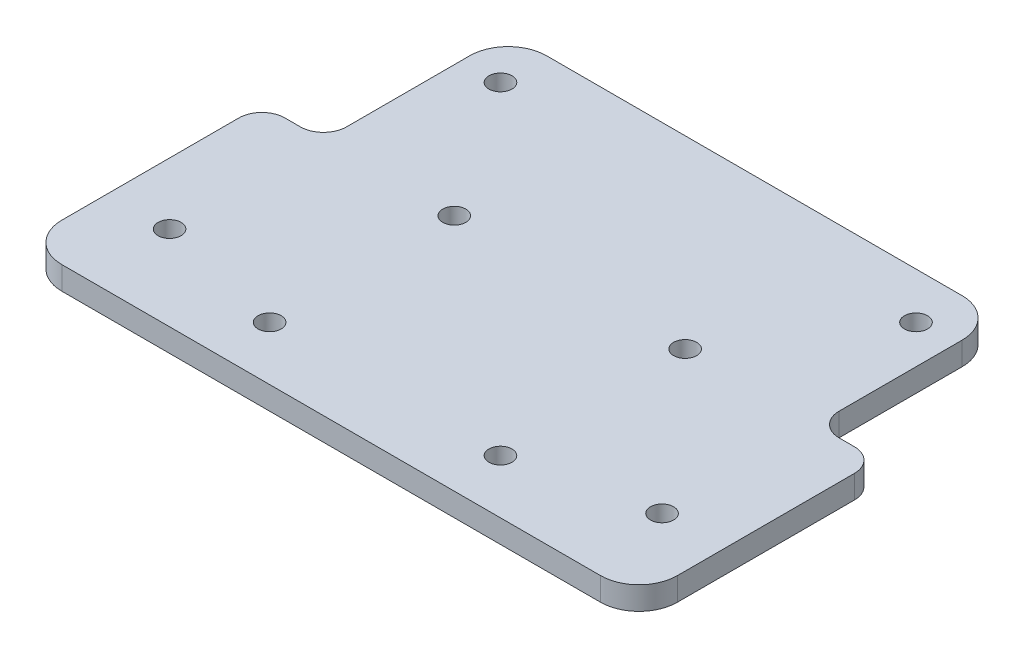
ISO-10303-21;
HEADER;
FILE_DESCRIPTION(('STEP AP214'),'2;1');
FILE_NAME('part.step','',(''),(''),'','','');
FILE_SCHEMA(('AUTOMOTIVE_DESIGN { 1 0 10303 214 1 1 1 1 }'));
ENDSEC;
DATA;
#1=APPLICATION_CONTEXT('core data for automotive mechanical design processes');
#2=APPLICATION_PROTOCOL_DEFINITION('international standard','automotive_design',2000,#1);
#3=PRODUCT_CONTEXT('',#1,'mechanical');
#4=PRODUCT('Part','Part','',(#3));
#5=PRODUCT_RELATED_PRODUCT_CATEGORY('part','',(#4));
#6=PRODUCT_DEFINITION_FORMATION('','',#4);
#7=PRODUCT_DEFINITION_CONTEXT('part definition',#1,'design');
#8=PRODUCT_DEFINITION('design','',#6,#7);
#9=PRODUCT_DEFINITION_SHAPE('','',#8);
#10=(LENGTH_UNIT() NAMED_UNIT(*) SI_UNIT(.MILLI.,.METRE.));
#11=(NAMED_UNIT(*) PLANE_ANGLE_UNIT() SI_UNIT($,.RADIAN.));
#12=(NAMED_UNIT(*) SI_UNIT($,.STERADIAN.) SOLID_ANGLE_UNIT());
#13=UNCERTAINTY_MEASURE_WITH_UNIT(LENGTH_MEASURE(1.E-05),#10,'distance_accuracy_value','');
#14=(GEOMETRIC_REPRESENTATION_CONTEXT(3) GLOBAL_UNCERTAINTY_ASSIGNED_CONTEXT((#13)) GLOBAL_UNIT_ASSIGNED_CONTEXT((#10,
#11,#12)) REPRESENTATION_CONTEXT('',''));
#15=CARTESIAN_POINT('',(0.,0.,0.));
#16=DIRECTION('',(0.,0.,1.));
#17=DIRECTION('',(1.,0.,0.));
#18=AXIS2_PLACEMENT_3D('',#15,#16,#17);
#19=CARTESIAN_POINT('',(32.,3.,0.));
#20=DIRECTION('',(1.,0.,0.));
#21=DIRECTION('',(0.,0.,-1.));
#22=AXIS2_PLACEMENT_3D('',#19,#20,#21);
#23=PLANE('',#22);
#24=DIRECTION('',(0.,0.,1.));
#25=VECTOR('',#24,1.);
#26=CARTESIAN_POINT('',(32.,0.,0.));
#27=LINE('',#26,#25);
#28=CARTESIAN_POINT('',(32.,0.,-20.));
#29=VERTEX_POINT('',#28);
#30=CARTESIAN_POINT('',(32.,0.,-3.99999999999999));
#31=VERTEX_POINT('',#30);
#32=EDGE_CURVE('E165',#29,#31,#27,.T.);
#33=ORIENTED_EDGE('',*,*,#32,.F.);
#34=DIRECTION('',(0.,-1.,0.));
#35=VECTOR('',#34,1.);
#36=CARTESIAN_POINT('',(32.,3.,-20.));
#37=LINE('',#36,#35);
#38=CARTESIAN_POINT('',(32.,3.,-20.));
#39=VERTEX_POINT('',#38);
#40=EDGE_CURVE('E260',#29,#39,#37,.F.);
#41=ORIENTED_EDGE('',*,*,#40,.T.);
#42=DIRECTION('',(0.,0.,1.));
#43=VECTOR('',#42,1.);
#44=CARTESIAN_POINT('',(32.,3.,0.));
#45=LINE('',#44,#43);
#46=CARTESIAN_POINT('',(32.,3.,-3.99999999999999));
#47=VERTEX_POINT('',#46);
#48=EDGE_CURVE('E181',#39,#47,#45,.T.);
#49=ORIENTED_EDGE('',*,*,#48,.T.);
#50=DIRECTION('',(0.,-1.,0.));
#51=VECTOR('',#50,1.);
#52=CARTESIAN_POINT('',(32.,0.,-3.99999999999999));
#53=LINE('',#52,#51);
#54=EDGE_CURVE('E206',#47,#31,#53,.T.);
#55=ORIENTED_EDGE('',*,*,#54,.T.);
#56=EDGE_LOOP('',(#33,#41,#49,#55));
#57=FACE_BOUND('',#56,.T.);
#58=ADVANCED_FACE('F43',(#57),#23,.T.);
#59=CARTESIAN_POINT('',(0.,3.,-25.));
#60=DIRECTION('',(0.,0.,-1.));
#61=DIRECTION('',(-1.,0.,0.));
#62=AXIS2_PLACEMENT_3D('',#59,#60,#61);
#63=PLANE('',#62);
#64=DIRECTION('',(1.,0.,0.));
#65=VECTOR('',#64,1.);
#66=CARTESIAN_POINT('',(0.,0.,-25.));
#67=LINE('',#66,#65);
#68=CARTESIAN_POINT('',(-27.,0.,-25.));
#69=VERTEX_POINT('',#68);
#70=CARTESIAN_POINT('',(27.,0.,-25.));
#71=VERTEX_POINT('',#70);
#72=EDGE_CURVE('E332',#69,#71,#67,.T.);
#73=ORIENTED_EDGE('',*,*,#72,.F.);
#74=DIRECTION('',(0.,-1.,0.));
#75=VECTOR('',#74,1.);
#76=CARTESIAN_POINT('',(-27.,3.,-25.));
#77=LINE('',#76,#75);
#78=CARTESIAN_POINT('',(-27.,3.,-25.));
#79=VERTEX_POINT('',#78);
#80=EDGE_CURVE('E252',#69,#79,#77,.F.);
#81=ORIENTED_EDGE('',*,*,#80,.T.);
#82=DIRECTION('',(1.,0.,0.));
#83=VECTOR('',#82,1.);
#84=CARTESIAN_POINT('',(0.,3.,-25.));
#85=LINE('',#84,#83);
#86=CARTESIAN_POINT('',(27.,3.,-25.));
#87=VERTEX_POINT('',#86);
#88=EDGE_CURVE('E320',#79,#87,#85,.T.);
#89=ORIENTED_EDGE('',*,*,#88,.T.);
#90=DIRECTION('',(0.,-1.,0.));
#91=VECTOR('',#90,1.);
#92=CARTESIAN_POINT('',(27.,3.,-25.));
#93=LINE('',#92,#91);
#94=EDGE_CURVE('E249',#87,#71,#93,.T.);
#95=ORIENTED_EDGE('',*,*,#94,.T.);
#96=EDGE_LOOP('',(#73,#81,#89,#95));
#97=FACE_BOUND('',#96,.T.);
#98=ADVANCED_FACE('F370',(#97),#63,.T.);
#99=CARTESIAN_POINT('',(-32.,3.,0.));
#100=DIRECTION('',(1.,0.,0.));
#101=DIRECTION('',(0.,0.,-1.));
#102=AXIS2_PLACEMENT_3D('',#99,#100,#101);
#103=PLANE('',#102);
#104=DIRECTION('',(0.,0.,1.));
#105=VECTOR('',#104,1.);
#106=CARTESIAN_POINT('',(-32.,3.,0.));
#107=LINE('',#106,#105);
#108=CARTESIAN_POINT('',(-32.,3.,-20.));
#109=VERTEX_POINT('',#108);
#110=CARTESIAN_POINT('',(-32.,3.,-3.99999999999999));
#111=VERTEX_POINT('',#110);
#112=EDGE_CURVE('E323',#109,#111,#107,.T.);
#113=ORIENTED_EDGE('',*,*,#112,.F.);
#114=DIRECTION('',(0.,-1.,0.));
#115=VECTOR('',#114,1.);
#116=CARTESIAN_POINT('',(-32.,0.,-20.));
#117=LINE('',#116,#115);
#118=CARTESIAN_POINT('',(-32.,0.,-20.));
#119=VERTEX_POINT('',#118);
#120=EDGE_CURVE('E224',#109,#119,#117,.T.);
#121=ORIENTED_EDGE('',*,*,#120,.T.);
#122=DIRECTION('',(0.,0.,1.));
#123=VECTOR('',#122,1.);
#124=CARTESIAN_POINT('',(-32.,0.,0.));
#125=LINE('',#124,#123);
#126=CARTESIAN_POINT('',(-32.,0.,-3.99999999999999));
#127=VERTEX_POINT('',#126);
#128=EDGE_CURVE('E335',#119,#127,#125,.T.);
#129=ORIENTED_EDGE('',*,*,#128,.T.);
#130=DIRECTION('',(0.,-1.,0.));
#131=VECTOR('',#130,1.);
#132=CARTESIAN_POINT('',(-32.,3.,-3.99999999999999));
#133=LINE('',#132,#131);
#134=EDGE_CURVE('E171',#127,#111,#133,.F.);
#135=ORIENTED_EDGE('',*,*,#134,.T.);
#136=EDGE_LOOP('',(#113,#121,#129,#135));
#137=FACE_BOUND('',#136,.T.);
#138=ADVANCED_FACE('F363',(#137),#103,.F.);
#139=CARTESIAN_POINT('',(0.,3.,-0.999999999999966));
#140=DIRECTION('',(0.,0.,1.));
#141=DIRECTION('',(1.,0.,0.));
#142=AXIS2_PLACEMENT_3D('',#139,#140,#141);
#143=PLANE('',#142);
#144=DIRECTION('',(-1.,0.,0.));
#145=VECTOR('',#144,1.);
#146=CARTESIAN_POINT('',(0.,0.,-0.999999999999966));
#147=LINE('',#146,#145);
#148=CARTESIAN_POINT('',(-35.,0.,-0.999999999999993));
#149=VERTEX_POINT('',#148);
#150=CARTESIAN_POINT('',(-37.,0.,-0.999999999999994));
#151=VERTEX_POINT('',#150);
#152=EDGE_CURVE('E337',#149,#151,#147,.T.);
#153=ORIENTED_EDGE('',*,*,#152,.T.);
#154=DIRECTION('',(0.,-1.,0.));
#155=VECTOR('',#154,1.);
#156=CARTESIAN_POINT('',(-37.,3.,-0.999999999999994));
#157=LINE('',#156,#155);
#158=CARTESIAN_POINT('',(-37.,3.,-0.999999999999994));
#159=VERTEX_POINT('',#158);
#160=EDGE_CURVE('E214',#151,#159,#157,.F.);
#161=ORIENTED_EDGE('',*,*,#160,.T.);
#162=DIRECTION('',(-1.,0.,0.));
#163=VECTOR('',#162,1.);
#164=CARTESIAN_POINT('',(0.,3.,-0.999999999999966));
#165=LINE('',#164,#163);
#166=CARTESIAN_POINT('',(-35.,3.,-0.999999999999993));
#167=VERTEX_POINT('',#166);
#168=EDGE_CURVE('E325',#167,#159,#165,.T.);
#169=ORIENTED_EDGE('',*,*,#168,.F.);
#170=DIRECTION('',(0.,-1.,0.));
#171=VECTOR('',#170,1.);
#172=CARTESIAN_POINT('',(-35.,0.,-0.999999999999993));
#173=LINE('',#172,#171);
#174=EDGE_CURVE('E211',#167,#149,#173,.T.);
#175=ORIENTED_EDGE('',*,*,#174,.T.);
#176=EDGE_LOOP('',(#153,#161,#169,#175));
#177=FACE_BOUND('',#176,.T.);
#178=ADVANCED_FACE('F356',(#177),#143,.F.);
#179=CARTESIAN_POINT('',(-40.,3.,0.));
#180=DIRECTION('',(-1.,0.,0.));
#181=DIRECTION('',(0.,0.,1.));
#182=AXIS2_PLACEMENT_3D('',#179,#180,#181);
#183=PLANE('',#182);
#184=DIRECTION('',(0.,0.,-1.));
#185=VECTOR('',#184,1.);
#186=CARTESIAN_POINT('',(-40.,0.,0.));
#187=LINE('',#186,#185);
#188=CARTESIAN_POINT('',(-40.,0.,25.));
#189=VERTEX_POINT('',#188);
#190=CARTESIAN_POINT('',(-40.,0.,2.00000000000001));
#191=VERTEX_POINT('',#190);
#192=EDGE_CURVE('E273',#189,#191,#187,.T.);
#193=ORIENTED_EDGE('',*,*,#192,.F.);
#194=DIRECTION('',(0.,1.,0.));
#195=VECTOR('',#194,1.);
#196=CARTESIAN_POINT('',(-40.,3.,25.));
#197=LINE('',#196,#195);
#198=CARTESIAN_POINT('',(-40.,3.,25.));
#199=VERTEX_POINT('',#198);
#200=EDGE_CURVE('E11',#189,#199,#197,.T.);
#201=ORIENTED_EDGE('',*,*,#200,.T.);
#202=DIRECTION('',(0.,0.,-1.));
#203=VECTOR('',#202,1.);
#204=CARTESIAN_POINT('',(-40.,3.,0.));
#205=LINE('',#204,#203);
#206=CARTESIAN_POINT('',(-40.,3.,2.00000000000001));
#207=VERTEX_POINT('',#206);
#208=EDGE_CURVE('E328',#199,#207,#205,.T.);
#209=ORIENTED_EDGE('',*,*,#208,.T.);
#210=DIRECTION('',(0.,-1.,0.));
#211=VECTOR('',#210,1.);
#212=CARTESIAN_POINT('',(-40.,0.,2.00000000000001));
#213=LINE('',#212,#211);
#214=EDGE_CURVE('E208',#207,#191,#213,.T.);
#215=ORIENTED_EDGE('',*,*,#214,.T.);
#216=EDGE_LOOP('',(#193,#201,#209,#215));
#217=FACE_BOUND('',#216,.T.);
#218=ADVANCED_FACE('F351',(#217),#183,.T.);
#219=CARTESIAN_POINT('',(40.,3.,0.));
#220=DIRECTION('',(-1.,0.,0.));
#221=DIRECTION('',(0.,0.,1.));
#222=AXIS2_PLACEMENT_3D('',#219,#220,#221);
#223=PLANE('',#222);
#224=DIRECTION('',(0.,0.,-1.));
#225=VECTOR('',#224,1.);
#226=CARTESIAN_POINT('',(40.,3.,0.));
#227=LINE('',#226,#225);
#228=CARTESIAN_POINT('',(40.,3.,25.));
#229=VERTEX_POINT('',#228);
#230=CARTESIAN_POINT('',(40.,3.,2.00000000000001));
#231=VERTEX_POINT('',#230);
#232=EDGE_CURVE('E191',#229,#231,#227,.T.);
#233=ORIENTED_EDGE('',*,*,#232,.F.);
#234=DIRECTION('',(0.,1.,0.));
#235=VECTOR('',#234,1.);
#236=CARTESIAN_POINT('',(40.,0.,25.));
#237=LINE('',#236,#235);
#238=CARTESIAN_POINT('',(40.,0.,25.));
#239=VERTEX_POINT('',#238);
#240=EDGE_CURVE('E51',#229,#239,#237,.F.);
#241=ORIENTED_EDGE('',*,*,#240,.T.);
#242=DIRECTION('',(0.,0.,-1.));
#243=VECTOR('',#242,1.);
#244=CARTESIAN_POINT('',(40.,0.,0.));
#245=LINE('',#244,#243);
#246=CARTESIAN_POINT('',(40.,0.,2.00000000000001));
#247=VERTEX_POINT('',#246);
#248=EDGE_CURVE('E182',#239,#247,#245,.T.);
#249=ORIENTED_EDGE('',*,*,#248,.T.);
#250=DIRECTION('',(0.,-1.,0.));
#251=VECTOR('',#250,1.);
#252=CARTESIAN_POINT('',(40.,3.,2.00000000000001));
#253=LINE('',#252,#251);
#254=EDGE_CURVE('E198',#247,#231,#253,.F.);
#255=ORIENTED_EDGE('',*,*,#254,.T.);
#256=EDGE_LOOP('',(#233,#241,#249,#255));
#257=FACE_BOUND('',#256,.T.);
#258=ADVANCED_FACE('F268',(#257),#223,.F.);
#259=CARTESIAN_POINT('',(0.,3.,-0.999999999999966));
#260=DIRECTION('',(0.,0.,-1.));
#261=DIRECTION('',(-1.,0.,0.));
#262=AXIS2_PLACEMENT_3D('',#259,#260,#261);
#263=PLANE('',#262);
#264=DIRECTION('',(1.,0.,0.));
#265=VECTOR('',#264,1.);
#266=CARTESIAN_POINT('',(0.,3.,-0.999999999999966));
#267=LINE('',#266,#265);
#268=CARTESIAN_POINT('',(35.,3.,-0.999999999999993));
#269=VERTEX_POINT('',#268);
#270=CARTESIAN_POINT('',(37.,3.,-0.999999999999994));
#271=VERTEX_POINT('',#270);
#272=EDGE_CURVE('E187',#269,#271,#267,.T.);
#273=ORIENTED_EDGE('',*,*,#272,.T.);
#274=DIRECTION('',(0.,-1.,0.));
#275=VECTOR('',#274,1.);
#276=CARTESIAN_POINT('',(37.,0.,-0.999999999999994));
#277=LINE('',#276,#275);
#278=CARTESIAN_POINT('',(37.,0.,-0.999999999999994));
#279=VERTEX_POINT('',#278);
#280=EDGE_CURVE('E180',#271,#279,#277,.T.);
#281=ORIENTED_EDGE('',*,*,#280,.T.);
#282=DIRECTION('',(1.,0.,0.));
#283=VECTOR('',#282,1.);
#284=CARTESIAN_POINT('',(0.,0.,-0.999999999999966));
#285=LINE('',#284,#283);
#286=CARTESIAN_POINT('',(35.,0.,-0.999999999999993));
#287=VERTEX_POINT('',#286);
#288=EDGE_CURVE('E163',#287,#279,#285,.T.);
#289=ORIENTED_EDGE('',*,*,#288,.F.);
#290=DIRECTION('',(0.,-1.,0.));
#291=VECTOR('',#290,1.);
#292=CARTESIAN_POINT('',(35.,3.,-0.999999999999993));
#293=LINE('',#292,#291);
#294=EDGE_CURVE('E177',#287,#269,#293,.F.);
#295=ORIENTED_EDGE('',*,*,#294,.T.);
#296=EDGE_LOOP('',(#273,#281,#289,#295));
#297=FACE_BOUND('',#296,.T.);
#298=ADVANCED_FACE('F176',(#297),#263,.T.);
#299=CARTESIAN_POINT('',(0.,3.,0.));
#300=DIRECTION('',(0.,1.,0.));
#301=DIRECTION('',(0.,0.,1.));
#302=AXIS2_PLACEMENT_3D('',#299,#300,#301);
#303=PLANE('',#302);
#304=CARTESIAN_POINT('',(15.,3.,-1.00000000000001));
#305=DIRECTION('',(0.,1.,0.));
#306=DIRECTION('',(0.,0.,-1.));
#307=AXIS2_PLACEMENT_3D('',#304,#305,#306);
#308=CIRCLE('',#307,1.5);
#309=CARTESIAN_POINT('',(15.,3.,-2.50000000000001));
#310=VERTEX_POINT('',#309);
#311=EDGE_CURVE('E283',#310,#310,#308,.T.);
#312=ORIENTED_EDGE('',*,*,#311,.F.);
#313=EDGE_LOOP('',(#312));
#314=FACE_BOUND('',#313,.T.);
#315=CARTESIAN_POINT('',(15.,3.,23.));
#316=DIRECTION('',(0.,1.,0.));
#317=DIRECTION('',(0.,0.,1.));
#318=AXIS2_PLACEMENT_3D('',#315,#316,#317);
#319=CIRCLE('',#318,1.5);
#320=CARTESIAN_POINT('',(15.,3.,24.5));
#321=VERTEX_POINT('',#320);
#322=EDGE_CURVE('E289',#321,#321,#319,.T.);
#323=ORIENTED_EDGE('',*,*,#322,.F.);
#324=EDGE_LOOP('',(#323));
#325=FACE_BOUND('',#324,.T.);
#326=CARTESIAN_POINT('',(-15.,3.,23.));
#327=DIRECTION('',(0.,1.,0.));
#328=DIRECTION('',(0.,0.,-1.));
#329=AXIS2_PLACEMENT_3D('',#326,#327,#328);
#330=CIRCLE('',#329,1.5);
#331=CARTESIAN_POINT('',(-15.,3.,21.5));
#332=VERTEX_POINT('',#331);
#333=EDGE_CURVE('E286',#332,#332,#330,.T.);
#334=ORIENTED_EDGE('',*,*,#333,.F.);
#335=EDGE_LOOP('',(#334));
#336=FACE_BOUND('',#335,.T.);
#337=CARTESIAN_POINT('',(-15.,3.,-1.));
#338=DIRECTION('',(0.,1.,0.));
#339=DIRECTION('',(0.,0.,1.));
#340=AXIS2_PLACEMENT_3D('',#337,#338,#339);
#341=CIRCLE('',#340,1.5);
#342=CARTESIAN_POINT('',(-15.,3.,0.499999999999997));
#343=VERTEX_POINT('',#342);
#344=EDGE_CURVE('E229',#343,#343,#341,.T.);
#345=ORIENTED_EDGE('',*,*,#344,.F.);
#346=EDGE_LOOP('',(#345));
#347=FACE_BOUND('',#346,.T.);
#348=CARTESIAN_POINT('',(32.,3.,19.));
#349=DIRECTION('',(0.,1.,0.));
#350=DIRECTION('',(0.,0.,-1.));
#351=AXIS2_PLACEMENT_3D('',#348,#349,#350);
#352=CIRCLE('',#351,1.5);
#353=CARTESIAN_POINT('',(32.,3.,17.5));
#354=VERTEX_POINT('',#353);
#355=EDGE_CURVE('E309',#354,#354,#352,.T.);
#356=ORIENTED_EDGE('',*,*,#355,.F.);
#357=EDGE_LOOP('',(#356));
#358=FACE_BOUND('',#357,.T.);
#359=CARTESIAN_POINT('',(27.,3.,-19.));
#360=DIRECTION('',(0.,1.,0.));
#361=DIRECTION('',(0.,0.,-1.));
#362=AXIS2_PLACEMENT_3D('',#359,#360,#361);
#363=CIRCLE('',#362,1.5);
#364=CARTESIAN_POINT('',(27.,3.,-20.5));
#365=VERTEX_POINT('',#364);
#366=EDGE_CURVE('E303',#365,#365,#363,.T.);
#367=ORIENTED_EDGE('',*,*,#366,.F.);
#368=EDGE_LOOP('',(#367));
#369=FACE_BOUND('',#368,.T.);
#370=CARTESIAN_POINT('',(-32.,3.,19.));
#371=DIRECTION('',(0.,1.,0.));
#372=DIRECTION('',(0.,0.,1.));
#373=AXIS2_PLACEMENT_3D('',#370,#371,#372);
#374=CIRCLE('',#373,1.5);
#375=CARTESIAN_POINT('',(-32.,3.,20.5));
#376=VERTEX_POINT('',#375);
#377=EDGE_CURVE('E296',#376,#376,#374,.T.);
#378=ORIENTED_EDGE('',*,*,#377,.F.);
#379=EDGE_LOOP('',(#378));
#380=FACE_BOUND('',#379,.T.);
#381=CARTESIAN_POINT('',(-27.,3.,-19.));
#382=DIRECTION('',(0.,1.,0.));
#383=DIRECTION('',(0.,0.,1.));
#384=AXIS2_PLACEMENT_3D('',#381,#382,#383);
#385=CIRCLE('',#384,1.5);
#386=CARTESIAN_POINT('',(-27.,3.,-17.5));
#387=VERTEX_POINT('',#386);
#388=EDGE_CURVE('E299',#387,#387,#385,.T.);
#389=ORIENTED_EDGE('',*,*,#388,.F.);
#390=EDGE_LOOP('',(#389));
#391=FACE_BOUND('',#390,.T.);
#392=ORIENTED_EDGE('',*,*,#88,.F.);
#393=CARTESIAN_POINT('',(-27.,3.,-20.));
#394=DIRECTION('',(0.,1.,0.));
#395=DIRECTION('',(0.,0.,1.));
#396=AXIS2_PLACEMENT_3D('',#393,#394,#395);
#397=CIRCLE('',#396,5.);
#398=EDGE_CURVE('E258',#79,#109,#397,.T.);
#399=ORIENTED_EDGE('',*,*,#398,.T.);
#400=ORIENTED_EDGE('',*,*,#112,.T.);
#401=CARTESIAN_POINT('',(-35.,3.,-3.99999999999999));
#402=DIRECTION('',(0.,1.,0.));
#403=DIRECTION('',(0.,0.,1.));
#404=AXIS2_PLACEMENT_3D('',#401,#402,#403);
#405=CIRCLE('',#404,3.);
#406=EDGE_CURVE('E222',#111,#167,#405,.F.);
#407=ORIENTED_EDGE('',*,*,#406,.T.);
#408=ORIENTED_EDGE('',*,*,#168,.T.);
#409=CARTESIAN_POINT('',(-37.,3.,2.00000000000001));
#410=DIRECTION('',(0.,1.,0.));
#411=DIRECTION('',(0.,0.,1.));
#412=AXIS2_PLACEMENT_3D('',#409,#410,#411);
#413=CIRCLE('',#412,3.);
#414=EDGE_CURVE('E201',#159,#207,#413,.T.);
#415=ORIENTED_EDGE('',*,*,#414,.T.);
#416=ORIENTED_EDGE('',*,*,#208,.F.);
#417=CARTESIAN_POINT('',(-35.,3.,25.));
#418=DIRECTION('',(0.,1.,0.));
#419=DIRECTION('',(0.,0.,1.));
#420=AXIS2_PLACEMENT_3D('',#417,#418,#419);
#421=CIRCLE('',#420,5.);
#422=CARTESIAN_POINT('',(-35.,3.,30.));
#423=VERTEX_POINT('',#422);
#424=EDGE_CURVE('E66',#199,#423,#421,.T.);
#425=ORIENTED_EDGE('',*,*,#424,.T.);
#426=DIRECTION('',(1.,0.,0.));
#427=VECTOR('',#426,1.);
#428=CARTESIAN_POINT('',(-40.,3.,30.));
#429=LINE('',#428,#427);
#430=CARTESIAN_POINT('',(35.,3.,30.));
#431=VERTEX_POINT('',#430);
#432=EDGE_CURVE('E277',#423,#431,#429,.T.);
#433=ORIENTED_EDGE('',*,*,#432,.T.);
#434=CARTESIAN_POINT('',(35.,3.,25.));
#435=DIRECTION('',(0.,1.,0.));
#436=DIRECTION('',(0.,0.,1.));
#437=AXIS2_PLACEMENT_3D('',#434,#435,#436);
#438=CIRCLE('',#437,5.);
#439=EDGE_CURVE('E58',#431,#229,#438,.T.);
#440=ORIENTED_EDGE('',*,*,#439,.T.);
#441=ORIENTED_EDGE('',*,*,#232,.T.);
#442=CARTESIAN_POINT('',(37.,3.,2.00000000000001));
#443=DIRECTION('',(0.,1.,0.));
#444=DIRECTION('',(0.,0.,1.));
#445=AXIS2_PLACEMENT_3D('',#442,#443,#444);
#446=CIRCLE('',#445,3.);
#447=EDGE_CURVE('E204',#231,#271,#446,.T.);
#448=ORIENTED_EDGE('',*,*,#447,.T.);
#449=ORIENTED_EDGE('',*,*,#272,.F.);
#450=CARTESIAN_POINT('',(35.,3.,-3.99999999999999));
#451=DIRECTION('',(0.,1.,0.));
#452=DIRECTION('',(0.,0.,1.));
#453=AXIS2_PLACEMENT_3D('',#450,#451,#452);
#454=CIRCLE('',#453,3.);
#455=EDGE_CURVE('E170',#269,#47,#454,.F.);
#456=ORIENTED_EDGE('',*,*,#455,.T.);
#457=ORIENTED_EDGE('',*,*,#48,.F.);
#458=CARTESIAN_POINT('',(27.,3.,-20.));
#459=DIRECTION('',(0.,1.,0.));
#460=DIRECTION('',(0.,0.,1.));
#461=AXIS2_PLACEMENT_3D('',#458,#459,#460);
#462=CIRCLE('',#461,5.);
#463=EDGE_CURVE('E256',#39,#87,#462,.T.);
#464=ORIENTED_EDGE('',*,*,#463,.T.);
#465=EDGE_LOOP('',(#392,#399,#400,#407,#408,#415,#416,#425,#433,#440,#441,#448,#449,#456,#457,#464));
#466=FACE_BOUND('',#465,.T.);
#467=ADVANCED_FACE('F281',(#314,#325,#336,#347,#358,#369,#380,#391,#466),#303,.T.);
#468=CARTESIAN_POINT('',(0.,0.,0.));
#469=DIRECTION('',(0.,1.,0.));
#470=DIRECTION('',(0.,0.,1.));
#471=AXIS2_PLACEMENT_3D('',#468,#469,#470);
#472=PLANE('',#471);
#473=CARTESIAN_POINT('',(15.,0.,-1.00000000000001));
#474=DIRECTION('',(0.,1.,0.));
#475=DIRECTION('',(0.,0.,1.));
#476=AXIS2_PLACEMENT_3D('',#473,#474,#475);
#477=CIRCLE('',#476,1.5);
#478=CARTESIAN_POINT('',(15.,0.,0.499999999999988));
#479=VERTEX_POINT('',#478);
#480=EDGE_CURVE('E235',#479,#479,#477,.T.);
#481=ORIENTED_EDGE('',*,*,#480,.T.);
#482=EDGE_LOOP('',(#481));
#483=FACE_BOUND('',#482,.T.);
#484=CARTESIAN_POINT('',(15.,0.,23.));
#485=DIRECTION('',(0.,1.,0.));
#486=DIRECTION('',(0.,0.,1.));
#487=AXIS2_PLACEMENT_3D('',#484,#485,#486);
#488=CIRCLE('',#487,1.5);
#489=CARTESIAN_POINT('',(15.,0.,24.5));
#490=VERTEX_POINT('',#489);
#491=EDGE_CURVE('E232',#490,#490,#488,.T.);
#492=ORIENTED_EDGE('',*,*,#491,.T.);
#493=EDGE_LOOP('',(#492));
#494=FACE_BOUND('',#493,.T.);
#495=CARTESIAN_POINT('',(-15.,0.,23.));
#496=DIRECTION('',(0.,1.,0.));
#497=DIRECTION('',(0.,0.,1.));
#498=AXIS2_PLACEMENT_3D('',#495,#496,#497);
#499=CIRCLE('',#498,1.5);
#500=CARTESIAN_POINT('',(-15.,0.,24.5));
#501=VERTEX_POINT('',#500);
#502=EDGE_CURVE('E228',#501,#501,#499,.T.);
#503=ORIENTED_EDGE('',*,*,#502,.T.);
#504=EDGE_LOOP('',(#503));
#505=FACE_BOUND('',#504,.T.);
#506=CARTESIAN_POINT('',(-15.,0.,-1.));
#507=DIRECTION('',(0.,1.,0.));
#508=DIRECTION('',(0.,0.,1.));
#509=AXIS2_PLACEMENT_3D('',#506,#507,#508);
#510=CIRCLE('',#509,1.5);
#511=CARTESIAN_POINT('',(-15.,0.,0.499999999999997));
#512=VERTEX_POINT('',#511);
#513=EDGE_CURVE('E225',#512,#512,#510,.T.);
#514=ORIENTED_EDGE('',*,*,#513,.T.);
#515=EDGE_LOOP('',(#514));
#516=FACE_BOUND('',#515,.T.);
#517=CARTESIAN_POINT('',(32.,0.,19.));
#518=DIRECTION('',(0.,1.,0.));
#519=DIRECTION('',(0.,0.,-1.));
#520=AXIS2_PLACEMENT_3D('',#517,#518,#519);
#521=CIRCLE('',#520,1.5);
#522=CARTESIAN_POINT('',(32.,0.,17.5));
#523=VERTEX_POINT('',#522);
#524=EDGE_CURVE('E238',#523,#523,#521,.T.);
#525=ORIENTED_EDGE('',*,*,#524,.T.);
#526=EDGE_LOOP('',(#525));
#527=FACE_BOUND('',#526,.T.);
#528=CARTESIAN_POINT('',(27.,0.,-19.));
#529=DIRECTION('',(0.,1.,0.));
#530=DIRECTION('',(0.,0.,-1.));
#531=AXIS2_PLACEMENT_3D('',#528,#529,#530);
#532=CIRCLE('',#531,1.5);
#533=CARTESIAN_POINT('',(27.,0.,-20.5));
#534=VERTEX_POINT('',#533);
#535=EDGE_CURVE('E306',#534,#534,#532,.T.);
#536=ORIENTED_EDGE('',*,*,#535,.T.);
#537=EDGE_LOOP('',(#536));
#538=FACE_BOUND('',#537,.T.);
#539=CARTESIAN_POINT('',(-32.,0.,19.));
#540=DIRECTION('',(0.,1.,0.));
#541=DIRECTION('',(0.,0.,1.));
#542=AXIS2_PLACEMENT_3D('',#539,#540,#541);
#543=CIRCLE('',#542,1.5);
#544=CARTESIAN_POINT('',(-32.,0.,20.5));
#545=VERTEX_POINT('',#544);
#546=EDGE_CURVE('E300',#545,#545,#543,.T.);
#547=ORIENTED_EDGE('',*,*,#546,.T.);
#548=EDGE_LOOP('',(#547));
#549=FACE_BOUND('',#548,.T.);
#550=CARTESIAN_POINT('',(-27.,0.,-19.));
#551=DIRECTION('',(0.,1.,0.));
#552=DIRECTION('',(0.,0.,1.));
#553=AXIS2_PLACEMENT_3D('',#550,#551,#552);
#554=CIRCLE('',#553,1.5);
#555=CARTESIAN_POINT('',(-27.,0.,-17.5));
#556=VERTEX_POINT('',#555);
#557=EDGE_CURVE('E314',#556,#556,#554,.T.);
#558=ORIENTED_EDGE('',*,*,#557,.T.);
#559=EDGE_LOOP('',(#558));
#560=FACE_BOUND('',#559,.T.);
#561=ORIENTED_EDGE('',*,*,#128,.F.);
#562=CARTESIAN_POINT('',(-27.,0.,-20.));
#563=DIRECTION('',(0.,1.,0.));
#564=DIRECTION('',(0.,0.,1.));
#565=AXIS2_PLACEMENT_3D('',#562,#563,#564);
#566=CIRCLE('',#565,5.);
#567=EDGE_CURVE('E247',#119,#69,#566,.F.);
#568=ORIENTED_EDGE('',*,*,#567,.T.);
#569=ORIENTED_EDGE('',*,*,#72,.T.);
#570=CARTESIAN_POINT('',(27.,0.,-20.));
#571=DIRECTION('',(0.,1.,0.));
#572=DIRECTION('',(0.,0.,1.));
#573=AXIS2_PLACEMENT_3D('',#570,#571,#572);
#574=CIRCLE('',#573,5.);
#575=EDGE_CURVE('E245',#71,#29,#574,.F.);
#576=ORIENTED_EDGE('',*,*,#575,.T.);
#577=ORIENTED_EDGE('',*,*,#32,.T.);
#578=CARTESIAN_POINT('',(35.,0.,-3.99999999999999));
#579=DIRECTION('',(0.,1.,0.));
#580=DIRECTION('',(0.,0.,1.));
#581=AXIS2_PLACEMENT_3D('',#578,#579,#580);
#582=CIRCLE('',#581,3.);
#583=EDGE_CURVE('E158',#31,#287,#582,.T.);
#584=ORIENTED_EDGE('',*,*,#583,.T.);
#585=ORIENTED_EDGE('',*,*,#288,.T.);
#586=CARTESIAN_POINT('',(37.,0.,2.00000000000001));
#587=DIRECTION('',(0.,1.,0.));
#588=DIRECTION('',(0.,0.,1.));
#589=AXIS2_PLACEMENT_3D('',#586,#587,#588);
#590=CIRCLE('',#589,3.);
#591=EDGE_CURVE('E196',#279,#247,#590,.F.);
#592=ORIENTED_EDGE('',*,*,#591,.T.);
#593=ORIENTED_EDGE('',*,*,#248,.F.);
#594=CARTESIAN_POINT('',(35.,0.,25.));
#595=DIRECTION('',(0.,1.,0.));
#596=DIRECTION('',(0.,0.,1.));
#597=AXIS2_PLACEMENT_3D('',#594,#595,#596);
#598=CIRCLE('',#597,5.);
#599=CARTESIAN_POINT('',(35.,0.,30.));
#600=VERTEX_POINT('',#599);
#601=EDGE_CURVE('E243',#239,#600,#598,.F.);
#602=ORIENTED_EDGE('',*,*,#601,.T.);
#603=DIRECTION('',(1.,0.,0.));
#604=VECTOR('',#603,1.);
#605=CARTESIAN_POINT('',(-40.,0.,30.));
#606=LINE('',#605,#604);
#607=CARTESIAN_POINT('',(-35.,0.,30.));
#608=VERTEX_POINT('',#607);
#609=EDGE_CURVE('E279',#608,#600,#606,.T.);
#610=ORIENTED_EDGE('',*,*,#609,.F.);
#611=CARTESIAN_POINT('',(-35.,0.,25.));
#612=DIRECTION('',(0.,1.,0.));
#613=DIRECTION('',(0.,0.,1.));
#614=AXIS2_PLACEMENT_3D('',#611,#612,#613);
#615=CIRCLE('',#614,5.);
#616=EDGE_CURVE('E241',#608,#189,#615,.F.);
#617=ORIENTED_EDGE('',*,*,#616,.T.);
#618=ORIENTED_EDGE('',*,*,#192,.T.);
#619=CARTESIAN_POINT('',(-37.,0.,2.00000000000001));
#620=DIRECTION('',(0.,1.,0.));
#621=DIRECTION('',(0.,0.,1.));
#622=AXIS2_PLACEMENT_3D('',#619,#620,#621);
#623=CIRCLE('',#622,3.);
#624=EDGE_CURVE('E189',#191,#151,#623,.F.);
#625=ORIENTED_EDGE('',*,*,#624,.T.);
#626=ORIENTED_EDGE('',*,*,#152,.F.);
#627=CARTESIAN_POINT('',(-35.,0.,-3.99999999999999));
#628=DIRECTION('',(0.,1.,0.));
#629=DIRECTION('',(0.,0.,1.));
#630=AXIS2_PLACEMENT_3D('',#627,#628,#629);
#631=CIRCLE('',#630,3.);
#632=EDGE_CURVE('E219',#149,#127,#631,.T.);
#633=ORIENTED_EDGE('',*,*,#632,.T.);
#634=EDGE_LOOP('',(#561,#568,#569,#576,#577,#584,#585,#592,#593,#602,#610,#617,#618,#625,#626,#633));
#635=FACE_BOUND('',#634,.T.);
#636=ADVANCED_FACE('F161',(#483,#494,#505,#516,#527,#538,#549,#560,#635),#472,.F.);
#637=CARTESIAN_POINT('',(-27.,0.,-19.));
#638=DIRECTION('',(0.,1.,0.));
#639=DIRECTION('',(0.,0.,1.));
#640=AXIS2_PLACEMENT_3D('',#637,#638,#639);
#641=CYLINDRICAL_SURFACE('',#640,1.5);
#642=ORIENTED_EDGE('',*,*,#557,.F.);
#643=EDGE_LOOP('',(#642));
#644=FACE_BOUND('',#643,.T.);
#645=ORIENTED_EDGE('',*,*,#388,.T.);
#646=EDGE_LOOP('',(#645));
#647=FACE_BOUND('',#646,.T.);
#648=ADVANCED_FACE('F411',(#644,#647),#641,.F.);
#649=CARTESIAN_POINT('',(-32.,0.,19.));
#650=DIRECTION('',(0.,1.,0.));
#651=DIRECTION('',(0.,0.,1.));
#652=AXIS2_PLACEMENT_3D('',#649,#650,#651);
#653=CYLINDRICAL_SURFACE('',#652,1.5);
#654=ORIENTED_EDGE('',*,*,#546,.F.);
#655=EDGE_LOOP('',(#654));
#656=FACE_BOUND('',#655,.T.);
#657=ORIENTED_EDGE('',*,*,#377,.T.);
#658=EDGE_LOOP('',(#657));
#659=FACE_BOUND('',#658,.T.);
#660=ADVANCED_FACE('F417',(#656,#659),#653,.F.);
#661=CARTESIAN_POINT('',(27.,0.,-19.));
#662=DIRECTION('',(0.,1.,0.));
#663=DIRECTION('',(0.,0.,1.));
#664=AXIS2_PLACEMENT_3D('',#661,#662,#663);
#665=CYLINDRICAL_SURFACE('',#664,1.5);
#666=ORIENTED_EDGE('',*,*,#535,.F.);
#667=EDGE_LOOP('',(#666));
#668=FACE_BOUND('',#667,.T.);
#669=ORIENTED_EDGE('',*,*,#366,.T.);
#670=EDGE_LOOP('',(#669));
#671=FACE_BOUND('',#670,.T.);
#672=ADVANCED_FACE('F389',(#668,#671),#665,.F.);
#673=CARTESIAN_POINT('',(32.,0.,19.));
#674=DIRECTION('',(0.,1.,0.));
#675=DIRECTION('',(0.,0.,1.));
#676=AXIS2_PLACEMENT_3D('',#673,#674,#675);
#677=CYLINDRICAL_SURFACE('',#676,1.5);
#678=ORIENTED_EDGE('',*,*,#524,.F.);
#679=EDGE_LOOP('',(#678));
#680=FACE_BOUND('',#679,.T.);
#681=ORIENTED_EDGE('',*,*,#355,.T.);
#682=EDGE_LOOP('',(#681));
#683=FACE_BOUND('',#682,.T.);
#684=ADVANCED_FACE('F382',(#680,#683),#677,.F.);
#685=CARTESIAN_POINT('',(37.,3.,2.00000000000001));
#686=DIRECTION('',(0.,1.,0.));
#687=DIRECTION('',(0.,0.,1.));
#688=AXIS2_PLACEMENT_3D('',#685,#686,#687);
#689=CYLINDRICAL_SURFACE('',#688,3.);
#690=ORIENTED_EDGE('',*,*,#447,.F.);
#691=ORIENTED_EDGE('',*,*,#254,.F.);
#692=ORIENTED_EDGE('',*,*,#591,.F.);
#693=ORIENTED_EDGE('',*,*,#280,.F.);
#694=EDGE_LOOP('',(#690,#691,#692,#693));
#695=FACE_BOUND('',#694,.T.);
#696=ADVANCED_FACE('F380',(#695),#689,.T.);
#697=CARTESIAN_POINT('',(35.,3.,-3.99999999999999));
#698=DIRECTION('',(0.,1.,0.));
#699=DIRECTION('',(0.,0.,1.));
#700=AXIS2_PLACEMENT_3D('',#697,#698,#699);
#701=CYLINDRICAL_SURFACE('',#700,3.);
#702=ORIENTED_EDGE('',*,*,#455,.F.);
#703=ORIENTED_EDGE('',*,*,#294,.F.);
#704=ORIENTED_EDGE('',*,*,#583,.F.);
#705=ORIENTED_EDGE('',*,*,#54,.F.);
#706=EDGE_LOOP('',(#702,#703,#704,#705));
#707=FACE_BOUND('',#706,.T.);
#708=ADVANCED_FACE('F185',(#707),#701,.F.);
#709=CARTESIAN_POINT('',(-37.,3.,2.00000000000001));
#710=DIRECTION('',(0.,1.,0.));
#711=DIRECTION('',(0.,0.,1.));
#712=AXIS2_PLACEMENT_3D('',#709,#710,#711);
#713=CYLINDRICAL_SURFACE('',#712,3.);
#714=ORIENTED_EDGE('',*,*,#414,.F.);
#715=ORIENTED_EDGE('',*,*,#160,.F.);
#716=ORIENTED_EDGE('',*,*,#624,.F.);
#717=ORIENTED_EDGE('',*,*,#214,.F.);
#718=EDGE_LOOP('',(#714,#715,#716,#717));
#719=FACE_BOUND('',#718,.T.);
#720=ADVANCED_FACE('F350',(#719),#713,.T.);
#721=CARTESIAN_POINT('',(-35.,3.,-3.99999999999999));
#722=DIRECTION('',(0.,1.,0.));
#723=DIRECTION('',(0.,0.,1.));
#724=AXIS2_PLACEMENT_3D('',#721,#722,#723);
#725=CYLINDRICAL_SURFACE('',#724,3.);
#726=ORIENTED_EDGE('',*,*,#406,.F.);
#727=ORIENTED_EDGE('',*,*,#134,.F.);
#728=ORIENTED_EDGE('',*,*,#632,.F.);
#729=ORIENTED_EDGE('',*,*,#174,.F.);
#730=EDGE_LOOP('',(#726,#727,#728,#729));
#731=FACE_BOUND('',#730,.T.);
#732=ADVANCED_FACE('F358',(#731),#725,.F.);
#733=CARTESIAN_POINT('',(-15.,-7.,-1.));
#734=DIRECTION('',(0.,1.,0.));
#735=DIRECTION('',(0.,0.,1.));
#736=AXIS2_PLACEMENT_3D('',#733,#734,#735);
#737=CYLINDRICAL_SURFACE('',#736,1.5);
#738=ORIENTED_EDGE('',*,*,#344,.T.);
#739=EDGE_LOOP('',(#738));
#740=FACE_BOUND('',#739,.T.);
#741=ORIENTED_EDGE('',*,*,#513,.F.);
#742=EDGE_LOOP('',(#741));
#743=FACE_BOUND('',#742,.T.);
#744=ADVANCED_FACE('F426',(#740,#743),#737,.F.);
#745=CARTESIAN_POINT('',(-15.,-7.,23.));
#746=DIRECTION('',(0.,1.,0.));
#747=DIRECTION('',(0.,0.,1.));
#748=AXIS2_PLACEMENT_3D('',#745,#746,#747);
#749=CYLINDRICAL_SURFACE('',#748,1.5);
#750=ORIENTED_EDGE('',*,*,#333,.T.);
#751=EDGE_LOOP('',(#750));
#752=FACE_BOUND('',#751,.T.);
#753=ORIENTED_EDGE('',*,*,#502,.F.);
#754=EDGE_LOOP('',(#753));
#755=FACE_BOUND('',#754,.T.);
#756=ADVANCED_FACE('F429',(#752,#755),#749,.F.);
#757=CARTESIAN_POINT('',(15.,-7.,23.));
#758=DIRECTION('',(0.,1.,0.));
#759=DIRECTION('',(0.,0.,1.));
#760=AXIS2_PLACEMENT_3D('',#757,#758,#759);
#761=CYLINDRICAL_SURFACE('',#760,1.5);
#762=ORIENTED_EDGE('',*,*,#322,.T.);
#763=EDGE_LOOP('',(#762));
#764=FACE_BOUND('',#763,.T.);
#765=ORIENTED_EDGE('',*,*,#491,.F.);
#766=EDGE_LOOP('',(#765));
#767=FACE_BOUND('',#766,.T.);
#768=ADVANCED_FACE('F434',(#764,#767),#761,.F.);
#769=CARTESIAN_POINT('',(15.,-7.,-1.00000000000001));
#770=DIRECTION('',(0.,1.,0.));
#771=DIRECTION('',(0.,0.,1.));
#772=AXIS2_PLACEMENT_3D('',#769,#770,#771);
#773=CYLINDRICAL_SURFACE('',#772,1.5);
#774=ORIENTED_EDGE('',*,*,#311,.T.);
#775=EDGE_LOOP('',(#774));
#776=FACE_BOUND('',#775,.T.);
#777=ORIENTED_EDGE('',*,*,#480,.F.);
#778=EDGE_LOOP('',(#777));
#779=FACE_BOUND('',#778,.T.);
#780=ADVANCED_FACE('F431',(#776,#779),#773,.F.);
#781=CARTESIAN_POINT('',(-40.,0.,30.));
#782=DIRECTION('',(0.,0.,1.));
#783=DIRECTION('',(1.,0.,0.));
#784=AXIS2_PLACEMENT_3D('',#781,#782,#783);
#785=PLANE('',#784);
#786=ORIENTED_EDGE('',*,*,#609,.T.);
#787=DIRECTION('',(0.,1.,0.));
#788=VECTOR('',#787,1.);
#789=CARTESIAN_POINT('',(35.,3.,30.));
#790=LINE('',#789,#788);
#791=EDGE_CURVE('E264',#600,#431,#790,.T.);
#792=ORIENTED_EDGE('',*,*,#791,.T.);
#793=ORIENTED_EDGE('',*,*,#432,.F.);
#794=DIRECTION('',(0.,1.,0.));
#795=VECTOR('',#794,1.);
#796=CARTESIAN_POINT('',(-35.,0.,30.));
#797=LINE('',#796,#795);
#798=EDGE_CURVE('E262',#423,#608,#797,.F.);
#799=ORIENTED_EDGE('',*,*,#798,.T.);
#800=EDGE_LOOP('',(#786,#792,#793,#799));
#801=FACE_BOUND('',#800,.T.);
#802=ADVANCED_FACE('F276',(#801),#785,.T.);
#803=CARTESIAN_POINT('',(-27.,3.,-20.));
#804=DIRECTION('',(0.,1.,0.));
#805=DIRECTION('',(0.,0.,1.));
#806=AXIS2_PLACEMENT_3D('',#803,#804,#805);
#807=CYLINDRICAL_SURFACE('',#806,5.);
#808=ORIENTED_EDGE('',*,*,#398,.F.);
#809=ORIENTED_EDGE('',*,*,#80,.F.);
#810=ORIENTED_EDGE('',*,*,#567,.F.);
#811=ORIENTED_EDGE('',*,*,#120,.F.);
#812=EDGE_LOOP('',(#808,#809,#810,#811));
#813=FACE_BOUND('',#812,.T.);
#814=ADVANCED_FACE('F367',(#813),#807,.T.);
#815=CARTESIAN_POINT('',(27.,3.,-20.));
#816=DIRECTION('',(0.,-1.,0.));
#817=DIRECTION('',(0.,0.,-1.));
#818=AXIS2_PLACEMENT_3D('',#815,#816,#817);
#819=CYLINDRICAL_SURFACE('',#818,5.);
#820=ORIENTED_EDGE('',*,*,#463,.F.);
#821=ORIENTED_EDGE('',*,*,#40,.F.);
#822=ORIENTED_EDGE('',*,*,#575,.F.);
#823=ORIENTED_EDGE('',*,*,#94,.F.);
#824=EDGE_LOOP('',(#820,#821,#822,#823));
#825=FACE_BOUND('',#824,.T.);
#826=ADVANCED_FACE('F376',(#825),#819,.T.);
#827=CARTESIAN_POINT('',(35.,0.,25.));
#828=DIRECTION('',(0.,-1.,0.));
#829=DIRECTION('',(0.,0.,-1.));
#830=AXIS2_PLACEMENT_3D('',#827,#828,#829);
#831=CYLINDRICAL_SURFACE('',#830,5.);
#832=ORIENTED_EDGE('',*,*,#601,.F.);
#833=ORIENTED_EDGE('',*,*,#240,.F.);
#834=ORIENTED_EDGE('',*,*,#439,.F.);
#835=ORIENTED_EDGE('',*,*,#791,.F.);
#836=EDGE_LOOP('',(#832,#833,#834,#835));
#837=FACE_BOUND('',#836,.T.);
#838=ADVANCED_FACE('F274',(#837),#831,.T.);
#839=CARTESIAN_POINT('',(-35.,3.,25.));
#840=DIRECTION('',(0.,1.,0.));
#841=DIRECTION('',(0.,0.,1.));
#842=AXIS2_PLACEMENT_3D('',#839,#840,#841);
#843=CYLINDRICAL_SURFACE('',#842,5.);
#844=ORIENTED_EDGE('',*,*,#616,.F.);
#845=ORIENTED_EDGE('',*,*,#798,.F.);
#846=ORIENTED_EDGE('',*,*,#424,.F.);
#847=ORIENTED_EDGE('',*,*,#200,.F.);
#848=EDGE_LOOP('',(#844,#845,#846,#847));
#849=FACE_BOUND('',#848,.T.);
#850=ADVANCED_FACE('F45',(#849),#843,.T.);
#851=CLOSED_SHELL('',(#58,#98,#138,#178,#218,#258,#298,#467,#636,#648,#660,#672,#684,#696,#708,
#720,#732,#744,#756,#768,#780,#802,#814,#826,#838,#850));
#852=MANIFOLD_SOLID_BREP('B2',#851);
#853=ADVANCED_BREP_SHAPE_REPRESENTATION('',(#18,#852),#14);
#854=SHAPE_DEFINITION_REPRESENTATION(#9,#853);
ENDSEC;
END-ISO-10303-21;
